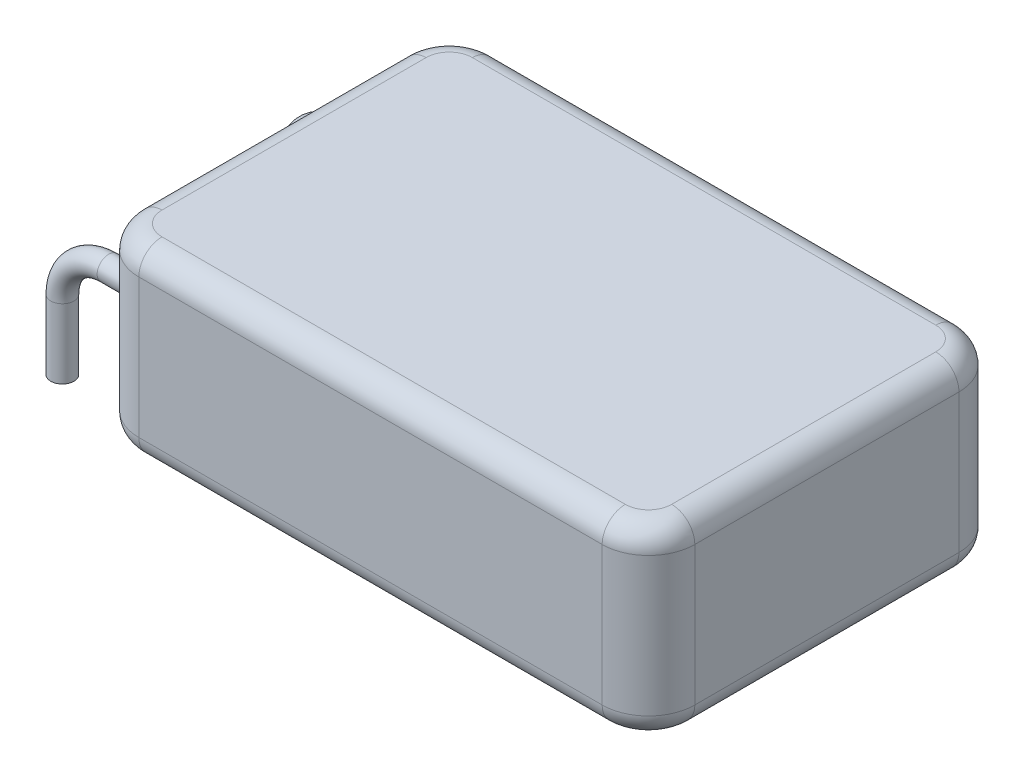
ISO-10303-21;
HEADER;
FILE_DESCRIPTION(('STEP AP214'),'2;1');
FILE_NAME('part.step','',(''),(''),'','','');
FILE_SCHEMA(('AUTOMOTIVE_DESIGN { 1 0 10303 214 1 1 1 1 }'));
ENDSEC;
DATA;
#1=APPLICATION_CONTEXT('core data for automotive mechanical design processes');
#2=APPLICATION_PROTOCOL_DEFINITION('international standard','automotive_design',2000,#1);
#3=PRODUCT_CONTEXT('',#1,'mechanical');
#4=PRODUCT('Part','Part','',(#3));
#5=PRODUCT_RELATED_PRODUCT_CATEGORY('part','',(#4));
#6=PRODUCT_DEFINITION_FORMATION('','',#4);
#7=PRODUCT_DEFINITION_CONTEXT('part definition',#1,'design');
#8=PRODUCT_DEFINITION('design','',#6,#7);
#9=PRODUCT_DEFINITION_SHAPE('','',#8);
#10=(LENGTH_UNIT() NAMED_UNIT(*) SI_UNIT(.MILLI.,.METRE.));
#11=(NAMED_UNIT(*) PLANE_ANGLE_UNIT() SI_UNIT($,.RADIAN.));
#12=(NAMED_UNIT(*) SI_UNIT($,.STERADIAN.) SOLID_ANGLE_UNIT());
#13=UNCERTAINTY_MEASURE_WITH_UNIT(LENGTH_MEASURE(1.E-05),#10,'distance_accuracy_value','');
#14=(GEOMETRIC_REPRESENTATION_CONTEXT(3) GLOBAL_UNCERTAINTY_ASSIGNED_CONTEXT((#13)) GLOBAL_UNIT_ASSIGNED_CONTEXT((#10,
#11,#12)) REPRESENTATION_CONTEXT('',''));
#15=CARTESIAN_POINT('',(0.,0.,0.));
#16=DIRECTION('',(0.,0.,1.));
#17=DIRECTION('',(1.,0.,0.));
#18=AXIS2_PLACEMENT_3D('',#15,#16,#17);
#19=CARTESIAN_POINT('',(-5.,4.,-2.85));
#20=DIRECTION('',(0.,-1.,0.));
#21=DIRECTION('',(0.,0.,-1.));
#22=AXIS2_PLACEMENT_3D('',#19,#20,#21);
#23=CYLINDRICAL_SURFACE('',#22,1.);
#24=DIRECTION('',(0.,-1.,0.));
#25=VECTOR('',#24,1.);
#26=CARTESIAN_POINT('',(-4.99999999999999,4.,-3.85));
#27=LINE('',#26,#25);
#28=CARTESIAN_POINT('',(-4.99999999999999,3.5,-3.85));
#29=VERTEX_POINT('',#28);
#30=CARTESIAN_POINT('',(-4.99999999999999,0.5,-3.85));
#31=VERTEX_POINT('',#30);
#32=EDGE_CURVE('E357',#29,#31,#27,.T.);
#33=ORIENTED_EDGE('',*,*,#32,.T.);
#34=CARTESIAN_POINT('',(-5.,0.5,-2.85));
#35=DIRECTION('',(0.,1.,0.));
#36=DIRECTION('',(0.,0.,1.));
#37=AXIS2_PLACEMENT_3D('',#34,#35,#36);
#38=CIRCLE('',#37,1.);
#39=CARTESIAN_POINT('',(-6.,0.5,-2.84999999999999));
#40=VERTEX_POINT('',#39);
#41=EDGE_CURVE('E51',#31,#40,#38,.T.);
#42=ORIENTED_EDGE('',*,*,#41,.T.);
#43=DIRECTION('',(0.,-1.,0.));
#44=VECTOR('',#43,1.);
#45=CARTESIAN_POINT('',(-6.,4.,-2.84999999999999));
#46=LINE('',#45,#44);
#47=CARTESIAN_POINT('',(-6.,3.5,-2.84999999999999));
#48=VERTEX_POINT('',#47);
#49=EDGE_CURVE('E372',#48,#40,#46,.T.);
#50=ORIENTED_EDGE('',*,*,#49,.F.);
#51=CARTESIAN_POINT('',(-5.,3.5,-2.85));
#52=DIRECTION('',(0.,1.,0.));
#53=DIRECTION('',(0.,0.,1.));
#54=AXIS2_PLACEMENT_3D('',#51,#52,#53);
#55=CIRCLE('',#54,1.);
#56=EDGE_CURVE('E209',#48,#29,#55,.F.);
#57=ORIENTED_EDGE('',*,*,#56,.T.);
#58=EDGE_LOOP('',(#33,#42,#50,#57));
#59=FACE_BOUND('',#58,.T.);
#60=ADVANCED_FACE('F41',(#59),#23,.T.);
#61=CARTESIAN_POINT('',(-6.,4.,-2.84999999999999));
#62=DIRECTION('',(1.,0.,0.));
#63=DIRECTION('',(0.,0.,-1.));
#64=AXIS2_PLACEMENT_3D('',#61,#62,#63);
#65=PLANE('',#64);
#66=CARTESIAN_POINT('',(-6.,2.,2.5));
#67=DIRECTION('',(1.,0.,0.));
#68=DIRECTION('',(0.,0.,-1.));
#69=AXIS2_PLACEMENT_3D('',#66,#67,#68);
#70=CIRCLE('',#69,0.25);
#71=CARTESIAN_POINT('',(-6.,2.,2.25));
#72=VERTEX_POINT('',#71);
#73=EDGE_CURVE('E179',#72,#72,#70,.F.);
#74=ORIENTED_EDGE('',*,*,#73,.F.);
#75=EDGE_LOOP('',(#74));
#76=FACE_BOUND('',#75,.T.);
#77=CARTESIAN_POINT('',(-6.,2.,-2.5));
#78=DIRECTION('',(1.,0.,0.));
#79=DIRECTION('',(0.,0.,-1.));
#80=AXIS2_PLACEMENT_3D('',#77,#78,#79);
#81=CIRCLE('',#80,0.25);
#82=CARTESIAN_POINT('',(-6.,2.,-2.75));
#83=VERTEX_POINT('',#82);
#84=EDGE_CURVE('E375',#83,#83,#81,.F.);
#85=ORIENTED_EDGE('',*,*,#84,.F.);
#86=EDGE_LOOP('',(#85));
#87=FACE_BOUND('',#86,.T.);
#88=ORIENTED_EDGE('',*,*,#49,.T.);
#89=DIRECTION('',(0.,0.,1.));
#90=VECTOR('',#89,1.);
#91=CARTESIAN_POINT('',(-6.,0.5,-2.84999999999999));
#92=LINE('',#91,#90);
#93=CARTESIAN_POINT('',(-6.,0.5,2.84999999999999));
#94=VERTEX_POINT('',#93);
#95=EDGE_CURVE('E281',#40,#94,#92,.T.);
#96=ORIENTED_EDGE('',*,*,#95,.T.);
#97=DIRECTION('',(0.,-1.,0.));
#98=VECTOR('',#97,1.);
#99=CARTESIAN_POINT('',(-6.,4.,2.84999999999999));
#100=LINE('',#99,#98);
#101=CARTESIAN_POINT('',(-6.,3.5,2.84999999999999));
#102=VERTEX_POINT('',#101);
#103=EDGE_CURVE('E368',#102,#94,#100,.T.);
#104=ORIENTED_EDGE('',*,*,#103,.F.);
#105=DIRECTION('',(0.,0.,1.));
#106=VECTOR('',#105,1.);
#107=CARTESIAN_POINT('',(-6.,3.5,-2.84999999999999));
#108=LINE('',#107,#106);
#109=EDGE_CURVE('E206',#102,#48,#108,.F.);
#110=ORIENTED_EDGE('',*,*,#109,.T.);
#111=EDGE_LOOP('',(#88,#96,#104,#110));
#112=FACE_BOUND('',#111,.T.);
#113=ADVANCED_FACE('F423',(#76,#87,#112),#65,.F.);
#114=CARTESIAN_POINT('',(-5.,4.,2.85));
#115=DIRECTION('',(0.,-1.,0.));
#116=DIRECTION('',(0.,0.,-1.));
#117=AXIS2_PLACEMENT_3D('',#114,#115,#116);
#118=CYLINDRICAL_SURFACE('',#117,1.);
#119=ORIENTED_EDGE('',*,*,#103,.T.);
#120=CARTESIAN_POINT('',(-5.,0.5,2.85));
#121=DIRECTION('',(0.,1.,0.));
#122=DIRECTION('',(0.,0.,1.));
#123=AXIS2_PLACEMENT_3D('',#120,#121,#122);
#124=CIRCLE('',#123,1.);
#125=CARTESIAN_POINT('',(-4.99999999999999,0.5,3.85));
#126=VERTEX_POINT('',#125);
#127=EDGE_CURVE('E278',#94,#126,#124,.T.);
#128=ORIENTED_EDGE('',*,*,#127,.T.);
#129=DIRECTION('',(0.,-1.,0.));
#130=VECTOR('',#129,1.);
#131=CARTESIAN_POINT('',(-4.99999999999999,4.,3.85));
#132=LINE('',#131,#130);
#133=CARTESIAN_POINT('',(-4.99999999999999,3.5,3.85));
#134=VERTEX_POINT('',#133);
#135=EDGE_CURVE('E364',#134,#126,#132,.T.);
#136=ORIENTED_EDGE('',*,*,#135,.F.);
#137=CARTESIAN_POINT('',(-5.,3.5,2.85));
#138=DIRECTION('',(0.,1.,0.));
#139=DIRECTION('',(0.,0.,1.));
#140=AXIS2_PLACEMENT_3D('',#137,#138,#139);
#141=CIRCLE('',#140,1.);
#142=EDGE_CURVE('E203',#134,#102,#141,.F.);
#143=ORIENTED_EDGE('',*,*,#142,.T.);
#144=EDGE_LOOP('',(#119,#128,#136,#143));
#145=FACE_BOUND('',#144,.T.);
#146=ADVANCED_FACE('F421',(#145),#118,.T.);
#147=CARTESIAN_POINT('',(-4.99999999999999,4.,3.85));
#148=DIRECTION('',(0.,0.,-1.));
#149=DIRECTION('',(-1.,0.,0.));
#150=AXIS2_PLACEMENT_3D('',#147,#148,#149);
#151=PLANE('',#150);
#152=ORIENTED_EDGE('',*,*,#135,.T.);
#153=DIRECTION('',(1.,0.,0.));
#154=VECTOR('',#153,1.);
#155=CARTESIAN_POINT('',(-4.99999999999999,0.5,3.85));
#156=LINE('',#155,#154);
#157=CARTESIAN_POINT('',(5.,0.5,3.85));
#158=VERTEX_POINT('',#157);
#159=EDGE_CURVE('E275',#126,#158,#156,.T.);
#160=ORIENTED_EDGE('',*,*,#159,.T.);
#161=DIRECTION('',(0.,-1.,0.));
#162=VECTOR('',#161,1.);
#163=CARTESIAN_POINT('',(5.,4.,3.85));
#164=LINE('',#163,#162);
#165=CARTESIAN_POINT('',(5.,3.5,3.85));
#166=VERTEX_POINT('',#165);
#167=EDGE_CURVE('E355',#166,#158,#164,.T.);
#168=ORIENTED_EDGE('',*,*,#167,.F.);
#169=DIRECTION('',(1.,0.,0.));
#170=VECTOR('',#169,1.);
#171=CARTESIAN_POINT('',(-4.99999999999999,3.5,3.85));
#172=LINE('',#171,#170);
#173=EDGE_CURVE('E200',#166,#134,#172,.F.);
#174=ORIENTED_EDGE('',*,*,#173,.T.);
#175=EDGE_LOOP('',(#152,#160,#168,#174));
#176=FACE_BOUND('',#175,.T.);
#177=ADVANCED_FACE('F408',(#176),#151,.F.);
#178=CARTESIAN_POINT('',(5.,4.,2.85));
#179=DIRECTION('',(0.,-1.,0.));
#180=DIRECTION('',(0.,0.,-1.));
#181=AXIS2_PLACEMENT_3D('',#178,#179,#180);
#182=CYLINDRICAL_SURFACE('',#181,0.999999999999999);
#183=ORIENTED_EDGE('',*,*,#167,.T.);
#184=CARTESIAN_POINT('',(5.,0.5,2.85));
#185=DIRECTION('',(0.,1.,0.));
#186=DIRECTION('',(0.,0.,1.));
#187=AXIS2_PLACEMENT_3D('',#184,#185,#186);
#188=CIRCLE('',#187,0.999999999999999);
#189=CARTESIAN_POINT('',(6.,0.5,2.84999999999999));
#190=VERTEX_POINT('',#189);
#191=EDGE_CURVE('E272',#158,#190,#188,.T.);
#192=ORIENTED_EDGE('',*,*,#191,.T.);
#193=DIRECTION('',(0.,-1.,0.));
#194=VECTOR('',#193,1.);
#195=CARTESIAN_POINT('',(6.,4.,2.84999999999999));
#196=LINE('',#195,#194);
#197=CARTESIAN_POINT('',(6.,3.5,2.84999999999999));
#198=VERTEX_POINT('',#197);
#199=EDGE_CURVE('E346',#198,#190,#196,.T.);
#200=ORIENTED_EDGE('',*,*,#199,.F.);
#201=CARTESIAN_POINT('',(5.,3.5,2.85));
#202=DIRECTION('',(0.,1.,0.));
#203=DIRECTION('',(0.,0.,1.));
#204=AXIS2_PLACEMENT_3D('',#201,#202,#203);
#205=CIRCLE('',#204,0.999999999999999);
#206=EDGE_CURVE('E197',#198,#166,#205,.F.);
#207=ORIENTED_EDGE('',*,*,#206,.T.);
#208=EDGE_LOOP('',(#183,#192,#200,#207));
#209=FACE_BOUND('',#208,.T.);
#210=ADVANCED_FACE('F404',(#209),#182,.T.);
#211=CARTESIAN_POINT('',(6.,4.,-2.84999999999999));
#212=DIRECTION('',(-1.,0.,0.));
#213=DIRECTION('',(0.,0.,1.));
#214=AXIS2_PLACEMENT_3D('',#211,#212,#213);
#215=PLANE('',#214);
#216=ORIENTED_EDGE('',*,*,#199,.T.);
#217=DIRECTION('',(0.,0.,-1.));
#218=VECTOR('',#217,1.);
#219=CARTESIAN_POINT('',(6.,0.5,-2.84999999999999));
#220=LINE('',#219,#218);
#221=CARTESIAN_POINT('',(6.,0.5,-2.84999999999999));
#222=VERTEX_POINT('',#221);
#223=EDGE_CURVE('E269',#190,#222,#220,.T.);
#224=ORIENTED_EDGE('',*,*,#223,.T.);
#225=DIRECTION('',(0.,-1.,0.));
#226=VECTOR('',#225,1.);
#227=CARTESIAN_POINT('',(6.,4.,-2.84999999999999));
#228=LINE('',#227,#226);
#229=CARTESIAN_POINT('',(6.,3.5,-2.84999999999999));
#230=VERTEX_POINT('',#229);
#231=EDGE_CURVE('E344',#230,#222,#228,.T.);
#232=ORIENTED_EDGE('',*,*,#231,.F.);
#233=DIRECTION('',(0.,0.,-1.));
#234=VECTOR('',#233,1.);
#235=CARTESIAN_POINT('',(6.,3.5,2.84999999999999));
#236=LINE('',#235,#234);
#237=EDGE_CURVE('E189',#230,#198,#236,.F.);
#238=ORIENTED_EDGE('',*,*,#237,.T.);
#239=EDGE_LOOP('',(#216,#224,#232,#238));
#240=FACE_BOUND('',#239,.T.);
#241=ADVANCED_FACE('F343',(#240),#215,.F.);
#242=CARTESIAN_POINT('',(5.,4.,-2.85));
#243=DIRECTION('',(0.,-1.,0.));
#244=DIRECTION('',(0.,0.,-1.));
#245=AXIS2_PLACEMENT_3D('',#242,#243,#244);
#246=CYLINDRICAL_SURFACE('',#245,1.);
#247=ORIENTED_EDGE('',*,*,#231,.T.);
#248=CARTESIAN_POINT('',(5.,0.5,-2.85));
#249=DIRECTION('',(0.,1.,0.));
#250=DIRECTION('',(0.,0.,1.));
#251=AXIS2_PLACEMENT_3D('',#248,#249,#250);
#252=CIRCLE('',#251,1.);
#253=CARTESIAN_POINT('',(4.99999999999999,0.5,-3.85));
#254=VERTEX_POINT('',#253);
#255=EDGE_CURVE('E214',#222,#254,#252,.T.);
#256=ORIENTED_EDGE('',*,*,#255,.T.);
#257=DIRECTION('',(0.,-1.,0.));
#258=VECTOR('',#257,1.);
#259=CARTESIAN_POINT('',(4.99999999999999,4.,-3.85));
#260=LINE('',#259,#258);
#261=CARTESIAN_POINT('',(4.99999999999999,3.5,-3.85));
#262=VERTEX_POINT('',#261);
#263=EDGE_CURVE('E351',#262,#254,#260,.T.);
#264=ORIENTED_EDGE('',*,*,#263,.F.);
#265=CARTESIAN_POINT('',(5.,3.5,-2.85));
#266=DIRECTION('',(0.,1.,0.));
#267=DIRECTION('',(0.,0.,1.));
#268=AXIS2_PLACEMENT_3D('',#265,#266,#267);
#269=CIRCLE('',#268,1.);
#270=EDGE_CURVE('E164',#262,#230,#269,.F.);
#271=ORIENTED_EDGE('',*,*,#270,.T.);
#272=EDGE_LOOP('',(#247,#256,#264,#271));
#273=FACE_BOUND('',#272,.T.);
#274=ADVANCED_FACE('F348',(#273),#246,.T.);
#275=CARTESIAN_POINT('',(-4.99999999999999,4.,-3.85));
#276=DIRECTION('',(0.,0.,1.));
#277=DIRECTION('',(1.,0.,0.));
#278=AXIS2_PLACEMENT_3D('',#275,#276,#277);
#279=PLANE('',#278);
#280=ORIENTED_EDGE('',*,*,#263,.T.);
#281=DIRECTION('',(-1.,0.,0.));
#282=VECTOR('',#281,1.);
#283=CARTESIAN_POINT('',(-4.99999999999999,0.5,-3.85));
#284=LINE('',#283,#282);
#285=EDGE_CURVE('E11',#254,#31,#284,.T.);
#286=ORIENTED_EDGE('',*,*,#285,.T.);
#287=ORIENTED_EDGE('',*,*,#32,.F.);
#288=DIRECTION('',(-1.,0.,0.));
#289=VECTOR('',#288,1.);
#290=CARTESIAN_POINT('',(4.99999999999999,3.5,-3.85));
#291=LINE('',#290,#289);
#292=EDGE_CURVE('E212',#29,#262,#291,.F.);
#293=ORIENTED_EDGE('',*,*,#292,.T.);
#294=EDGE_LOOP('',(#280,#286,#287,#293));
#295=FACE_BOUND('',#294,.T.);
#296=ADVANCED_FACE('F510',(#295),#279,.F.);
#297=CARTESIAN_POINT('',(-5.,4.,-2.85));
#298=DIRECTION('',(0.,1.,0.));
#299=DIRECTION('',(0.,0.,1.));
#300=AXIS2_PLACEMENT_3D('',#297,#298,#299);
#301=PLANE('',#300);
#302=DIRECTION('',(0.,0.,-1.));
#303=VECTOR('',#302,1.);
#304=CARTESIAN_POINT('',(5.5,4.,-2.84999999999999));
#305=LINE('',#304,#303);
#306=CARTESIAN_POINT('',(5.5,4.,2.84999999999999));
#307=VERTEX_POINT('',#306);
#308=CARTESIAN_POINT('',(5.5,4.,-2.85));
#309=VERTEX_POINT('',#308);
#310=EDGE_CURVE('E183',#307,#309,#305,.T.);
#311=ORIENTED_EDGE('',*,*,#310,.T.);
#312=CARTESIAN_POINT('',(5.,4.,-2.85));
#313=DIRECTION('',(0.,1.,0.));
#314=DIRECTION('',(0.,0.,1.));
#315=AXIS2_PLACEMENT_3D('',#312,#313,#314);
#316=CIRCLE('',#315,0.5);
#317=CARTESIAN_POINT('',(5.,4.,-3.35));
#318=VERTEX_POINT('',#317);
#319=EDGE_CURVE('E162',#309,#318,#316,.T.);
#320=ORIENTED_EDGE('',*,*,#319,.T.);
#321=DIRECTION('',(-1.,0.,0.));
#322=VECTOR('',#321,1.);
#323=CARTESIAN_POINT('',(-4.99999999999999,4.,-3.35));
#324=LINE('',#323,#322);
#325=CARTESIAN_POINT('',(-5.,4.,-3.35));
#326=VERTEX_POINT('',#325);
#327=EDGE_CURVE('E171',#318,#326,#324,.T.);
#328=ORIENTED_EDGE('',*,*,#327,.T.);
#329=CARTESIAN_POINT('',(-5.,4.,-2.85));
#330=DIRECTION('',(0.,1.,0.));
#331=DIRECTION('',(0.,0.,1.));
#332=AXIS2_PLACEMENT_3D('',#329,#330,#331);
#333=CIRCLE('',#332,0.5);
#334=CARTESIAN_POINT('',(-5.5,4.,-2.84999999999999));
#335=VERTEX_POINT('',#334);
#336=EDGE_CURVE('E178',#326,#335,#333,.T.);
#337=ORIENTED_EDGE('',*,*,#336,.T.);
#338=DIRECTION('',(0.,0.,1.));
#339=VECTOR('',#338,1.);
#340=CARTESIAN_POINT('',(-5.5,4.,2.84999999999999));
#341=LINE('',#340,#339);
#342=CARTESIAN_POINT('',(-5.5,4.,2.85));
#343=VERTEX_POINT('',#342);
#344=EDGE_CURVE('E384',#335,#343,#341,.T.);
#345=ORIENTED_EDGE('',*,*,#344,.T.);
#346=CARTESIAN_POINT('',(-5.,4.,2.85));
#347=DIRECTION('',(0.,1.,0.));
#348=DIRECTION('',(0.,0.,1.));
#349=AXIS2_PLACEMENT_3D('',#346,#347,#348);
#350=CIRCLE('',#349,0.5);
#351=CARTESIAN_POINT('',(-4.99999999999999,4.,3.35));
#352=VERTEX_POINT('',#351);
#353=EDGE_CURVE('E387',#343,#352,#350,.T.);
#354=ORIENTED_EDGE('',*,*,#353,.T.);
#355=DIRECTION('',(1.,0.,0.));
#356=VECTOR('',#355,1.);
#357=CARTESIAN_POINT('',(5.,4.,3.35));
#358=LINE('',#357,#356);
#359=CARTESIAN_POINT('',(5.,4.,3.35));
#360=VERTEX_POINT('',#359);
#361=EDGE_CURVE('E390',#352,#360,#358,.T.);
#362=ORIENTED_EDGE('',*,*,#361,.T.);
#363=CARTESIAN_POINT('',(5.,4.,2.85));
#364=DIRECTION('',(0.,1.,0.));
#365=DIRECTION('',(0.,0.,1.));
#366=AXIS2_PLACEMENT_3D('',#363,#364,#365);
#367=CIRCLE('',#366,0.499999999999999);
#368=EDGE_CURVE('E191',#360,#307,#367,.T.);
#369=ORIENTED_EDGE('',*,*,#368,.T.);
#370=EDGE_LOOP('',(#311,#320,#328,#337,#345,#354,#362,#369));
#371=FACE_BOUND('',#370,.T.);
#372=ADVANCED_FACE('F181',(#371),#301,.T.);
#373=CARTESIAN_POINT('',(-5.,0.,-2.85));
#374=DIRECTION('',(0.,1.,0.));
#375=DIRECTION('',(0.,0.,1.));
#376=AXIS2_PLACEMENT_3D('',#373,#374,#375);
#377=PLANE('',#376);
#378=DIRECTION('',(-1.,0.,0.));
#379=VECTOR('',#378,1.);
#380=CARTESIAN_POINT('',(-5.,0.,-3.35));
#381=LINE('',#380,#379);
#382=CARTESIAN_POINT('',(-5.,0.,-3.35));
#383=VERTEX_POINT('',#382);
#384=CARTESIAN_POINT('',(5.,0.,-3.35));
#385=VERTEX_POINT('',#384);
#386=EDGE_CURVE('E244',#383,#385,#381,.F.);
#387=ORIENTED_EDGE('',*,*,#386,.T.);
#388=CARTESIAN_POINT('',(5.,0.,-2.85));
#389=DIRECTION('',(0.,1.,0.));
#390=DIRECTION('',(0.,0.,1.));
#391=AXIS2_PLACEMENT_3D('',#388,#389,#390);
#392=CIRCLE('',#391,0.5);
#393=CARTESIAN_POINT('',(5.5,0.,-2.85));
#394=VERTEX_POINT('',#393);
#395=EDGE_CURVE('E265',#385,#394,#392,.F.);
#396=ORIENTED_EDGE('',*,*,#395,.T.);
#397=DIRECTION('',(0.,0.,-1.));
#398=VECTOR('',#397,1.);
#399=CARTESIAN_POINT('',(5.5,0.,-2.85));
#400=LINE('',#399,#398);
#401=CARTESIAN_POINT('',(5.5,0.,2.84999999999999));
#402=VERTEX_POINT('',#401);
#403=EDGE_CURVE('E262',#394,#402,#400,.F.);
#404=ORIENTED_EDGE('',*,*,#403,.T.);
#405=CARTESIAN_POINT('',(5.,0.,2.85));
#406=DIRECTION('',(0.,1.,0.));
#407=DIRECTION('',(0.,0.,1.));
#408=AXIS2_PLACEMENT_3D('',#405,#406,#407);
#409=CIRCLE('',#408,0.499999999999999);
#410=CARTESIAN_POINT('',(5.,0.,3.35));
#411=VERTEX_POINT('',#410);
#412=EDGE_CURVE('E259',#402,#411,#409,.F.);
#413=ORIENTED_EDGE('',*,*,#412,.T.);
#414=DIRECTION('',(1.,0.,0.));
#415=VECTOR('',#414,1.);
#416=CARTESIAN_POINT('',(-5.,0.,3.35));
#417=LINE('',#416,#415);
#418=CARTESIAN_POINT('',(-4.99999999999999,0.,3.35));
#419=VERTEX_POINT('',#418);
#420=EDGE_CURVE('E256',#411,#419,#417,.F.);
#421=ORIENTED_EDGE('',*,*,#420,.T.);
#422=CARTESIAN_POINT('',(-5.,0.,2.85));
#423=DIRECTION('',(0.,1.,0.));
#424=DIRECTION('',(0.,0.,1.));
#425=AXIS2_PLACEMENT_3D('',#422,#423,#424);
#426=CIRCLE('',#425,0.5);
#427=CARTESIAN_POINT('',(-5.5,0.,2.85));
#428=VERTEX_POINT('',#427);
#429=EDGE_CURVE('E253',#419,#428,#426,.F.);
#430=ORIENTED_EDGE('',*,*,#429,.T.);
#431=DIRECTION('',(0.,0.,1.));
#432=VECTOR('',#431,1.);
#433=CARTESIAN_POINT('',(-5.5,0.,-2.85));
#434=LINE('',#433,#432);
#435=CARTESIAN_POINT('',(-5.5,0.,-2.84999999999999));
#436=VERTEX_POINT('',#435);
#437=EDGE_CURVE('E250',#428,#436,#434,.F.);
#438=ORIENTED_EDGE('',*,*,#437,.T.);
#439=CARTESIAN_POINT('',(-5.,0.,-2.85));
#440=DIRECTION('',(0.,1.,0.));
#441=DIRECTION('',(0.,0.,1.));
#442=AXIS2_PLACEMENT_3D('',#439,#440,#441);
#443=CIRCLE('',#442,0.5);
#444=EDGE_CURVE('E247',#436,#383,#443,.F.);
#445=ORIENTED_EDGE('',*,*,#444,.T.);
#446=EDGE_LOOP('',(#387,#396,#404,#413,#421,#430,#438,#445));
#447=FACE_BOUND('',#446,.T.);
#448=ADVANCED_FACE('F326',(#447),#377,.F.);
#449=CARTESIAN_POINT('',(-8.,-0.5,-2.5));
#450=DIRECTION('',(0.,-1.,0.));
#451=DIRECTION('',(0.,0.,1.));
#452=AXIS2_PLACEMENT_3D('',#449,#450,#451);
#453=PLANE('',#452);
#454=CARTESIAN_POINT('',(-8.,-0.5,-2.5));
#455=DIRECTION('',(0.,-1.,0.));
#456=DIRECTION('',(0.,0.,1.));
#457=AXIS2_PLACEMENT_3D('',#454,#455,#456);
#458=CIRCLE('',#457,0.25);
#459=CARTESIAN_POINT('',(-8.,-0.5,-2.25));
#460=VERTEX_POINT('',#459);
#461=EDGE_CURVE('E740',#460,#460,#458,.T.);
#462=ORIENTED_EDGE('',*,*,#461,.T.);
#463=EDGE_LOOP('',(#462));
#464=FACE_BOUND('',#463,.T.);
#465=ADVANCED_FACE('F480',(#464),#453,.T.);
#466=CARTESIAN_POINT('',(-8.,-0.5,-2.5));
#467=DIRECTION('',(0.,1.,0.));
#468=DIRECTION('',(0.,0.,1.));
#469=AXIS2_PLACEMENT_3D('',#466,#467,#468);
#470=CYLINDRICAL_SURFACE('',#469,0.25);
#471=CARTESIAN_POINT('',(-8.,1.,-2.5));
#472=DIRECTION('',(0.,-1.,0.));
#473=DIRECTION('',(0.,0.,1.));
#474=AXIS2_PLACEMENT_3D('',#471,#472,#473);
#475=CIRCLE('',#474,0.25);
#476=CARTESIAN_POINT('',(-8.25,1.,-2.5));
#477=VERTEX_POINT('',#476);
#478=EDGE_CURVE('E747',#477,#477,#475,.T.);
#479=ORIENTED_EDGE('',*,*,#478,.T.);
#480=EDGE_LOOP('',(#479));
#481=FACE_BOUND('',#480,.T.);
#482=ORIENTED_EDGE('',*,*,#461,.F.);
#483=EDGE_LOOP('',(#482));
#484=FACE_BOUND('',#483,.T.);
#485=ADVANCED_FACE('F498',(#481,#484),#470,.T.);
#486=CARTESIAN_POINT('',(-7.,1.,-2.5));
#487=DIRECTION('',(0.,0.,-1.));
#488=DIRECTION('',(-1.,0.,0.));
#489=AXIS2_PLACEMENT_3D('',#486,#487,#488);
#490=TOROIDAL_SURFACE('',#489,1.,0.25);
#491=CARTESIAN_POINT('',(-7.,2.,-2.5));
#492=DIRECTION('',(-1.,0.,0.));
#493=DIRECTION('',(0.,0.,1.));
#494=AXIS2_PLACEMENT_3D('',#491,#492,#493);
#495=CIRCLE('',#494,0.25);
#496=CARTESIAN_POINT('',(-7.,2.25,-2.5));
#497=VERTEX_POINT('',#496);
#498=EDGE_CURVE('E751',#497,#497,#495,.T.);
#499=CARTESIAN_POINT('',(-7.,1.,-2.5));
#500=DIRECTION('',(0.,0.,-1.));
#501=DIRECTION('',(-1.,0.,0.));
#502=AXIS2_PLACEMENT_3D('',#499,#500,#501);
#503=CIRCLE('',#502,1.25);
#504=EDGE_CURVE('',#477,#497,#503,.T.);
#505=ORIENTED_EDGE('',*,*,#478,.F.);
#506=ORIENTED_EDGE('',*,*,#498,.T.);
#507=ORIENTED_EDGE('',*,*,#504,.T.);
#508=ORIENTED_EDGE('',*,*,#504,.F.);
#509=EDGE_LOOP('',(#505,#507,#506,#508));
#510=FACE_BOUND('',#509,.T.);
#511=ADVANCED_FACE('F492',(#510),#490,.T.);
#512=CARTESIAN_POINT('',(-7.,2.,-2.5));
#513=DIRECTION('',(1.,0.,0.));
#514=DIRECTION('',(0.,0.,-1.));
#515=AXIS2_PLACEMENT_3D('',#512,#513,#514);
#516=CYLINDRICAL_SURFACE('',#515,0.25);
#517=ORIENTED_EDGE('',*,*,#84,.T.);
#518=EDGE_LOOP('',(#517));
#519=FACE_BOUND('',#518,.T.);
#520=ORIENTED_EDGE('',*,*,#498,.F.);
#521=EDGE_LOOP('',(#520));
#522=FACE_BOUND('',#521,.T.);
#523=ADVANCED_FACE('F483',(#519,#522),#516,.T.);
#524=CARTESIAN_POINT('',(-8.,-0.5,2.5));
#525=DIRECTION('',(0.,-1.,0.));
#526=DIRECTION('',(0.,0.,1.));
#527=AXIS2_PLACEMENT_3D('',#524,#525,#526);
#528=PLANE('',#527);
#529=CARTESIAN_POINT('',(-8.,-0.5,2.5));
#530=DIRECTION('',(0.,-1.,0.));
#531=DIRECTION('',(0.,0.,1.));
#532=AXIS2_PLACEMENT_3D('',#529,#530,#531);
#533=CIRCLE('',#532,0.25);
#534=CARTESIAN_POINT('',(-8.,-0.5,2.75));
#535=VERTEX_POINT('',#534);
#536=EDGE_CURVE('E240',#535,#535,#533,.T.);
#537=ORIENTED_EDGE('',*,*,#536,.T.);
#538=EDGE_LOOP('',(#537));
#539=FACE_BOUND('',#538,.T.);
#540=ADVANCED_FACE('F473',(#539),#528,.T.);
#541=CARTESIAN_POINT('',(-8.,-0.5,2.5));
#542=DIRECTION('',(0.,1.,0.));
#543=DIRECTION('',(0.,0.,1.));
#544=AXIS2_PLACEMENT_3D('',#541,#542,#543);
#545=CYLINDRICAL_SURFACE('',#544,0.25);
#546=CARTESIAN_POINT('',(-8.,1.,2.5));
#547=DIRECTION('',(0.,-1.,0.));
#548=DIRECTION('',(0.,0.,1.));
#549=AXIS2_PLACEMENT_3D('',#546,#547,#548);
#550=CIRCLE('',#549,0.25);
#551=CARTESIAN_POINT('',(-8.25,1.,2.5));
#552=VERTEX_POINT('',#551);
#553=EDGE_CURVE('E735',#552,#552,#550,.T.);
#554=ORIENTED_EDGE('',*,*,#553,.T.);
#555=EDGE_LOOP('',(#554));
#556=FACE_BOUND('',#555,.T.);
#557=ORIENTED_EDGE('',*,*,#536,.F.);
#558=EDGE_LOOP('',(#557));
#559=FACE_BOUND('',#558,.T.);
#560=ADVANCED_FACE('F482',(#556,#559),#545,.T.);
#561=CARTESIAN_POINT('',(-7.,1.,2.5));
#562=DIRECTION('',(0.,0.,-1.));
#563=DIRECTION('',(-1.,0.,0.));
#564=AXIS2_PLACEMENT_3D('',#561,#562,#563);
#565=TOROIDAL_SURFACE('',#564,1.,0.25);
#566=CARTESIAN_POINT('',(-7.,2.,2.5));
#567=DIRECTION('',(-1.,0.,0.));
#568=DIRECTION('',(0.,0.,1.));
#569=AXIS2_PLACEMENT_3D('',#566,#567,#568);
#570=CIRCLE('',#569,0.25);
#571=CARTESIAN_POINT('',(-7.,2.25,2.5));
#572=VERTEX_POINT('',#571);
#573=EDGE_CURVE('E732',#572,#572,#570,.T.);
#574=CARTESIAN_POINT('',(-7.,1.,2.5));
#575=DIRECTION('',(0.,0.,-1.));
#576=DIRECTION('',(-1.,0.,0.));
#577=AXIS2_PLACEMENT_3D('',#574,#575,#576);
#578=CIRCLE('',#577,1.25);
#579=EDGE_CURVE('',#552,#572,#578,.T.);
#580=ORIENTED_EDGE('',*,*,#553,.F.);
#581=ORIENTED_EDGE('',*,*,#573,.T.);
#582=ORIENTED_EDGE('',*,*,#579,.T.);
#583=ORIENTED_EDGE('',*,*,#579,.F.);
#584=EDGE_LOOP('',(#580,#582,#581,#583));
#585=FACE_BOUND('',#584,.T.);
#586=ADVANCED_FACE('F477',(#585),#565,.T.);
#587=CARTESIAN_POINT('',(-7.,2.,2.5));
#588=DIRECTION('',(1.,0.,0.));
#589=DIRECTION('',(0.,0.,-1.));
#590=AXIS2_PLACEMENT_3D('',#587,#588,#589);
#591=CYLINDRICAL_SURFACE('',#590,0.25);
#592=ORIENTED_EDGE('',*,*,#73,.T.);
#593=EDGE_LOOP('',(#592));
#594=FACE_BOUND('',#593,.T.);
#595=ORIENTED_EDGE('',*,*,#573,.F.);
#596=EDGE_LOOP('',(#595));
#597=FACE_BOUND('',#596,.T.);
#598=ADVANCED_FACE('F472',(#594,#597),#591,.T.);
#599=CARTESIAN_POINT('',(-5.,3.5,2.85));
#600=DIRECTION('',(0.,1.,0.));
#601=DIRECTION('',(0.,0.,1.));
#602=AXIS2_PLACEMENT_3D('',#599,#600,#601);
#603=DEGENERATE_TOROIDAL_SURFACE('',#602,0.5,0.5,.T.);
#604=CARTESIAN_POINT('',(-5.5,3.5,2.85));
#605=DIRECTION('',(0.,0.,-1.));
#606=DIRECTION('',(-1.,0.,0.));
#607=AXIS2_PLACEMENT_3D('',#604,#605,#606);
#608=CIRCLE('',#607,0.5);
#609=EDGE_CURVE('E232',#102,#343,#608,.T.);
#610=ORIENTED_EDGE('',*,*,#609,.F.);
#611=ORIENTED_EDGE('',*,*,#142,.F.);
#612=CARTESIAN_POINT('',(-4.99999999999999,3.5,3.35));
#613=DIRECTION('',(1.,0.,0.));
#614=DIRECTION('',(0.,0.,-1.));
#615=AXIS2_PLACEMENT_3D('',#612,#613,#614);
#616=CIRCLE('',#615,0.5);
#617=EDGE_CURVE('E236',#352,#134,#616,.T.);
#618=ORIENTED_EDGE('',*,*,#617,.F.);
#619=ORIENTED_EDGE('',*,*,#353,.F.);
#620=EDGE_LOOP('',(#610,#611,#618,#619));
#621=FACE_BOUND('',#620,.T.);
#622=ADVANCED_FACE('F417',(#621),#603,.T.);
#623=CARTESIAN_POINT('',(-5.,3.5,3.35));
#624=DIRECTION('',(-1.,0.,0.));
#625=DIRECTION('',(0.,0.,1.));
#626=AXIS2_PLACEMENT_3D('',#623,#624,#625);
#627=CYLINDRICAL_SURFACE('',#626,0.5);
#628=ORIENTED_EDGE('',*,*,#617,.T.);
#629=ORIENTED_EDGE('',*,*,#173,.F.);
#630=CARTESIAN_POINT('',(5.,3.5,3.35));
#631=DIRECTION('',(1.,0.,0.));
#632=DIRECTION('',(0.,0.,-1.));
#633=AXIS2_PLACEMENT_3D('',#630,#631,#632);
#634=CIRCLE('',#633,0.5);
#635=EDGE_CURVE('E228',#360,#166,#634,.T.);
#636=ORIENTED_EDGE('',*,*,#635,.F.);
#637=ORIENTED_EDGE('',*,*,#361,.F.);
#638=EDGE_LOOP('',(#628,#629,#636,#637));
#639=FACE_BOUND('',#638,.T.);
#640=ADVANCED_FACE('F411',(#639),#627,.T.);
#641=CARTESIAN_POINT('',(-5.5,3.5,-2.85));
#642=DIRECTION('',(0.,0.,-1.));
#643=DIRECTION('',(-1.,0.,0.));
#644=AXIS2_PLACEMENT_3D('',#641,#642,#643);
#645=CYLINDRICAL_SURFACE('',#644,0.5);
#646=ORIENTED_EDGE('',*,*,#609,.T.);
#647=ORIENTED_EDGE('',*,*,#344,.F.);
#648=CARTESIAN_POINT('',(-5.5,3.5,-2.84999999999999));
#649=DIRECTION('',(0.,0.,-1.));
#650=DIRECTION('',(-1.,0.,0.));
#651=AXIS2_PLACEMENT_3D('',#648,#649,#650);
#652=CIRCLE('',#651,0.5);
#653=EDGE_CURVE('E224',#48,#335,#652,.T.);
#654=ORIENTED_EDGE('',*,*,#653,.F.);
#655=ORIENTED_EDGE('',*,*,#109,.F.);
#656=EDGE_LOOP('',(#646,#647,#654,#655));
#657=FACE_BOUND('',#656,.T.);
#658=ADVANCED_FACE('F465',(#657),#645,.T.);
#659=CARTESIAN_POINT('',(5.,3.5,2.85));
#660=DIRECTION('',(0.,1.,0.));
#661=DIRECTION('',(0.,0.,1.));
#662=AXIS2_PLACEMENT_3D('',#659,#660,#661);
#663=DEGENERATE_TOROIDAL_SURFACE('',#662,0.499999999999999,0.5,.T.);
#664=ORIENTED_EDGE('',*,*,#635,.T.);
#665=ORIENTED_EDGE('',*,*,#206,.F.);
#666=CARTESIAN_POINT('',(5.5,3.5,2.84999999999999));
#667=DIRECTION('',(0.,0.,-1.));
#668=DIRECTION('',(-1.,0.,0.));
#669=AXIS2_PLACEMENT_3D('',#666,#667,#668);
#670=CIRCLE('',#669,0.5);
#671=EDGE_CURVE('E220',#307,#198,#670,.T.);
#672=ORIENTED_EDGE('',*,*,#671,.F.);
#673=ORIENTED_EDGE('',*,*,#368,.F.);
#674=EDGE_LOOP('',(#664,#665,#672,#673));
#675=FACE_BOUND('',#674,.T.);
#676=ADVANCED_FACE('F399',(#675),#663,.T.);
#677=CARTESIAN_POINT('',(-5.,3.5,-2.85));
#678=DIRECTION('',(0.,1.,0.));
#679=DIRECTION('',(0.,0.,1.));
#680=AXIS2_PLACEMENT_3D('',#677,#678,#679);
#681=DEGENERATE_TOROIDAL_SURFACE('',#680,0.5,0.5,.T.);
#682=ORIENTED_EDGE('',*,*,#653,.T.);
#683=ORIENTED_EDGE('',*,*,#336,.F.);
#684=CARTESIAN_POINT('',(-5.,3.5,-3.35));
#685=DIRECTION('',(1.,0.,0.));
#686=DIRECTION('',(0.,0.,-1.));
#687=AXIS2_PLACEMENT_3D('',#684,#685,#686);
#688=CIRCLE('',#687,0.5);
#689=EDGE_CURVE('E174',#29,#326,#688,.T.);
#690=ORIENTED_EDGE('',*,*,#689,.F.);
#691=ORIENTED_EDGE('',*,*,#56,.F.);
#692=EDGE_LOOP('',(#682,#683,#690,#691));
#693=FACE_BOUND('',#692,.T.);
#694=ADVANCED_FACE('F459',(#693),#681,.T.);
#695=CARTESIAN_POINT('',(5.5,3.5,-2.85));
#696=DIRECTION('',(0.,0.,1.));
#697=DIRECTION('',(1.,0.,0.));
#698=AXIS2_PLACEMENT_3D('',#695,#696,#697);
#699=CYLINDRICAL_SURFACE('',#698,0.5);
#700=ORIENTED_EDGE('',*,*,#671,.T.);
#701=ORIENTED_EDGE('',*,*,#237,.F.);
#702=CARTESIAN_POINT('',(5.5,3.5,-2.85));
#703=DIRECTION('',(0.,0.,-1.));
#704=DIRECTION('',(-1.,0.,0.));
#705=AXIS2_PLACEMENT_3D('',#702,#703,#704);
#706=CIRCLE('',#705,0.5);
#707=EDGE_CURVE('E168',#309,#230,#706,.T.);
#708=ORIENTED_EDGE('',*,*,#707,.F.);
#709=ORIENTED_EDGE('',*,*,#310,.F.);
#710=EDGE_LOOP('',(#700,#701,#708,#709));
#711=FACE_BOUND('',#710,.T.);
#712=ADVANCED_FACE('F402',(#711),#699,.T.);
#713=CARTESIAN_POINT('',(-5.,3.5,-3.35));
#714=DIRECTION('',(1.,0.,0.));
#715=DIRECTION('',(0.,0.,-1.));
#716=AXIS2_PLACEMENT_3D('',#713,#714,#715);
#717=CYLINDRICAL_SURFACE('',#716,0.5);
#718=ORIENTED_EDGE('',*,*,#689,.T.);
#719=ORIENTED_EDGE('',*,*,#327,.F.);
#720=CARTESIAN_POINT('',(4.99999999999999,3.5,-3.35));
#721=DIRECTION('',(1.,0.,0.));
#722=DIRECTION('',(0.,1.,0.));
#723=AXIS2_PLACEMENT_3D('',#720,#721,#722);
#724=CIRCLE('',#723,0.5);
#725=EDGE_CURVE('E158',#262,#318,#724,.T.);
#726=ORIENTED_EDGE('',*,*,#725,.F.);
#727=ORIENTED_EDGE('',*,*,#292,.F.);
#728=EDGE_LOOP('',(#718,#719,#726,#727));
#729=FACE_BOUND('',#728,.T.);
#730=ADVANCED_FACE('F172',(#729),#717,.T.);
#731=CARTESIAN_POINT('',(5.,3.5,-2.85));
#732=DIRECTION('',(0.,1.,0.));
#733=DIRECTION('',(0.,0.,1.));
#734=AXIS2_PLACEMENT_3D('',#731,#732,#733);
#735=DEGENERATE_TOROIDAL_SURFACE('',#734,0.5,0.5,.T.);
#736=ORIENTED_EDGE('',*,*,#707,.T.);
#737=ORIENTED_EDGE('',*,*,#270,.F.);
#738=ORIENTED_EDGE('',*,*,#725,.T.);
#739=ORIENTED_EDGE('',*,*,#319,.F.);
#740=EDGE_LOOP('',(#736,#737,#738,#739));
#741=FACE_BOUND('',#740,.T.);
#742=ADVANCED_FACE('F160',(#741),#735,.T.);
#743=CARTESIAN_POINT('',(-5.,0.5,2.85));
#744=DIRECTION('',(0.,1.,0.));
#745=DIRECTION('',(0.,0.,1.));
#746=AXIS2_PLACEMENT_3D('',#743,#744,#745);
#747=DEGENERATE_TOROIDAL_SURFACE('',#746,0.5,0.5,.T.);
#748=CARTESIAN_POINT('',(-5.5,0.5,2.85));
#749=DIRECTION('',(0.,0.,-1.));
#750=DIRECTION('',(-1.,0.,0.));
#751=AXIS2_PLACEMENT_3D('',#748,#749,#750);
#752=CIRCLE('',#751,0.5);
#753=EDGE_CURVE('E307',#428,#94,#752,.T.);
#754=ORIENTED_EDGE('',*,*,#753,.F.);
#755=ORIENTED_EDGE('',*,*,#429,.F.);
#756=CARTESIAN_POINT('',(-4.99999999999999,0.5,3.35));
#757=DIRECTION('',(1.,0.,0.));
#758=DIRECTION('',(0.,0.,-1.));
#759=AXIS2_PLACEMENT_3D('',#756,#757,#758);
#760=CIRCLE('',#759,0.5);
#761=EDGE_CURVE('E45',#126,#419,#760,.T.);
#762=ORIENTED_EDGE('',*,*,#761,.F.);
#763=ORIENTED_EDGE('',*,*,#127,.F.);
#764=EDGE_LOOP('',(#754,#755,#762,#763));
#765=FACE_BOUND('',#764,.T.);
#766=ADVANCED_FACE('F43',(#765),#747,.T.);
#767=CARTESIAN_POINT('',(-4.99999999999999,0.5,3.35));
#768=DIRECTION('',(1.,0.,0.));
#769=DIRECTION('',(0.,0.,-1.));
#770=AXIS2_PLACEMENT_3D('',#767,#768,#769);
#771=CYLINDRICAL_SURFACE('',#770,0.5);
#772=ORIENTED_EDGE('',*,*,#761,.T.);
#773=ORIENTED_EDGE('',*,*,#420,.F.);
#774=CARTESIAN_POINT('',(5.,0.5,3.35));
#775=DIRECTION('',(1.,0.,0.));
#776=DIRECTION('',(0.,1.,0.));
#777=AXIS2_PLACEMENT_3D('',#774,#775,#776);
#778=CIRCLE('',#777,0.5);
#779=EDGE_CURVE('E304',#158,#411,#778,.T.);
#780=ORIENTED_EDGE('',*,*,#779,.F.);
#781=ORIENTED_EDGE('',*,*,#159,.F.);
#782=EDGE_LOOP('',(#772,#773,#780,#781));
#783=FACE_BOUND('',#782,.T.);
#784=ADVANCED_FACE('F320',(#783),#771,.T.);
#785=CARTESIAN_POINT('',(-5.5,0.5,-2.84999999999999));
#786=DIRECTION('',(0.,0.,1.));
#787=DIRECTION('',(1.,0.,0.));
#788=AXIS2_PLACEMENT_3D('',#785,#786,#787);
#789=CYLINDRICAL_SURFACE('',#788,0.5);
#790=ORIENTED_EDGE('',*,*,#753,.T.);
#791=ORIENTED_EDGE('',*,*,#95,.F.);
#792=CARTESIAN_POINT('',(-5.5,0.5,-2.84999999999999));
#793=DIRECTION('',(0.,0.,-1.));
#794=DIRECTION('',(-1.,0.,0.));
#795=AXIS2_PLACEMENT_3D('',#792,#793,#794);
#796=CIRCLE('',#795,0.5);
#797=EDGE_CURVE('E300',#436,#40,#796,.T.);
#798=ORIENTED_EDGE('',*,*,#797,.F.);
#799=ORIENTED_EDGE('',*,*,#437,.F.);
#800=EDGE_LOOP('',(#790,#791,#798,#799));
#801=FACE_BOUND('',#800,.T.);
#802=ADVANCED_FACE('F424',(#801),#789,.T.);
#803=CARTESIAN_POINT('',(5.,0.5,2.85));
#804=DIRECTION('',(0.,1.,0.));
#805=DIRECTION('',(0.,0.,1.));
#806=AXIS2_PLACEMENT_3D('',#803,#804,#805);
#807=DEGENERATE_TOROIDAL_SURFACE('',#806,0.499999999999999,0.5,.T.);
#808=ORIENTED_EDGE('',*,*,#779,.T.);
#809=ORIENTED_EDGE('',*,*,#412,.F.);
#810=CARTESIAN_POINT('',(5.5,0.5,2.85));
#811=DIRECTION('',(0.,0.,-1.));
#812=DIRECTION('',(-1.,0.,0.));
#813=AXIS2_PLACEMENT_3D('',#810,#811,#812);
#814=CIRCLE('',#813,0.5);
#815=EDGE_CURVE('E296',#190,#402,#814,.T.);
#816=ORIENTED_EDGE('',*,*,#815,.F.);
#817=ORIENTED_EDGE('',*,*,#191,.F.);
#818=EDGE_LOOP('',(#808,#809,#816,#817));
#819=FACE_BOUND('',#818,.T.);
#820=ADVANCED_FACE('F332',(#819),#807,.T.);
#821=CARTESIAN_POINT('',(-5.,0.5,-2.85));
#822=DIRECTION('',(0.,1.,0.));
#823=DIRECTION('',(0.,0.,1.));
#824=AXIS2_PLACEMENT_3D('',#821,#822,#823);
#825=DEGENERATE_TOROIDAL_SURFACE('',#824,0.5,0.5,.T.);
#826=ORIENTED_EDGE('',*,*,#797,.T.);
#827=ORIENTED_EDGE('',*,*,#41,.F.);
#828=CARTESIAN_POINT('',(-5.,0.5,-3.35));
#829=DIRECTION('',(1.,0.,0.));
#830=DIRECTION('',(0.,0.,-1.));
#831=AXIS2_PLACEMENT_3D('',#828,#829,#830);
#832=CIRCLE('',#831,0.5);
#833=EDGE_CURVE('E292',#383,#31,#832,.T.);
#834=ORIENTED_EDGE('',*,*,#833,.F.);
#835=ORIENTED_EDGE('',*,*,#444,.F.);
#836=EDGE_LOOP('',(#826,#827,#834,#835));
#837=FACE_BOUND('',#836,.T.);
#838=ADVANCED_FACE('F427',(#837),#825,.T.);
#839=CARTESIAN_POINT('',(5.5,0.5,-2.84999999999999));
#840=DIRECTION('',(0.,0.,-1.));
#841=DIRECTION('',(-1.,0.,0.));
#842=AXIS2_PLACEMENT_3D('',#839,#840,#841);
#843=CYLINDRICAL_SURFACE('',#842,0.5);
#844=ORIENTED_EDGE('',*,*,#815,.T.);
#845=ORIENTED_EDGE('',*,*,#403,.F.);
#846=CARTESIAN_POINT('',(5.5,0.5,-2.84999999999999));
#847=DIRECTION('',(0.,0.,-1.));
#848=DIRECTION('',(0.,1.,0.));
#849=AXIS2_PLACEMENT_3D('',#846,#847,#848);
#850=CIRCLE('',#849,0.5);
#851=EDGE_CURVE('E289',#222,#394,#850,.T.);
#852=ORIENTED_EDGE('',*,*,#851,.F.);
#853=ORIENTED_EDGE('',*,*,#223,.F.);
#854=EDGE_LOOP('',(#844,#845,#852,#853));
#855=FACE_BOUND('',#854,.T.);
#856=ADVANCED_FACE('F336',(#855),#843,.T.);
#857=CARTESIAN_POINT('',(-4.99999999999999,0.5,-3.35));
#858=DIRECTION('',(-1.,0.,0.));
#859=DIRECTION('',(0.,0.,1.));
#860=AXIS2_PLACEMENT_3D('',#857,#858,#859);
#861=CYLINDRICAL_SURFACE('',#860,0.5);
#862=ORIENTED_EDGE('',*,*,#833,.T.);
#863=ORIENTED_EDGE('',*,*,#285,.F.);
#864=CARTESIAN_POINT('',(5.,0.5,-3.35));
#865=DIRECTION('',(1.,0.,0.));
#866=DIRECTION('',(0.,0.,-1.));
#867=AXIS2_PLACEMENT_3D('',#864,#865,#866);
#868=CIRCLE('',#867,0.5);
#869=EDGE_CURVE('E286',#385,#254,#868,.T.);
#870=ORIENTED_EDGE('',*,*,#869,.F.);
#871=ORIENTED_EDGE('',*,*,#386,.F.);
#872=EDGE_LOOP('',(#862,#863,#870,#871));
#873=FACE_BOUND('',#872,.T.);
#874=ADVANCED_FACE('F435',(#873),#861,.T.);
#875=CARTESIAN_POINT('',(5.,0.5,-2.85));
#876=DIRECTION('',(0.,1.,0.));
#877=DIRECTION('',(0.,0.,1.));
#878=AXIS2_PLACEMENT_3D('',#875,#876,#877);
#879=DEGENERATE_TOROIDAL_SURFACE('',#878,0.5,0.5,.T.);
#880=ORIENTED_EDGE('',*,*,#851,.T.);
#881=ORIENTED_EDGE('',*,*,#395,.F.);
#882=ORIENTED_EDGE('',*,*,#869,.T.);
#883=ORIENTED_EDGE('',*,*,#255,.F.);
#884=EDGE_LOOP('',(#880,#881,#882,#883));
#885=FACE_BOUND('',#884,.T.);
#886=ADVANCED_FACE('F434',(#885),#879,.T.);
#887=CLOSED_SHELL('',(#60,#113,#146,#177,#210,#241,#274,#296,#372,#448,#465,#485,#511,#523,#540,
#560,#586,#598,#622,#640,#658,#676,#694,#712,#730,#742,#766,#784,#802,#820,#838,#856,#874,#886));
#888=MANIFOLD_SOLID_BREP('B2',#887);
#889=ADVANCED_BREP_SHAPE_REPRESENTATION('',(#18,#888),#14);
#890=SHAPE_DEFINITION_REPRESENTATION(#9,#889);
ENDSEC;
END-ISO-10303-21;
